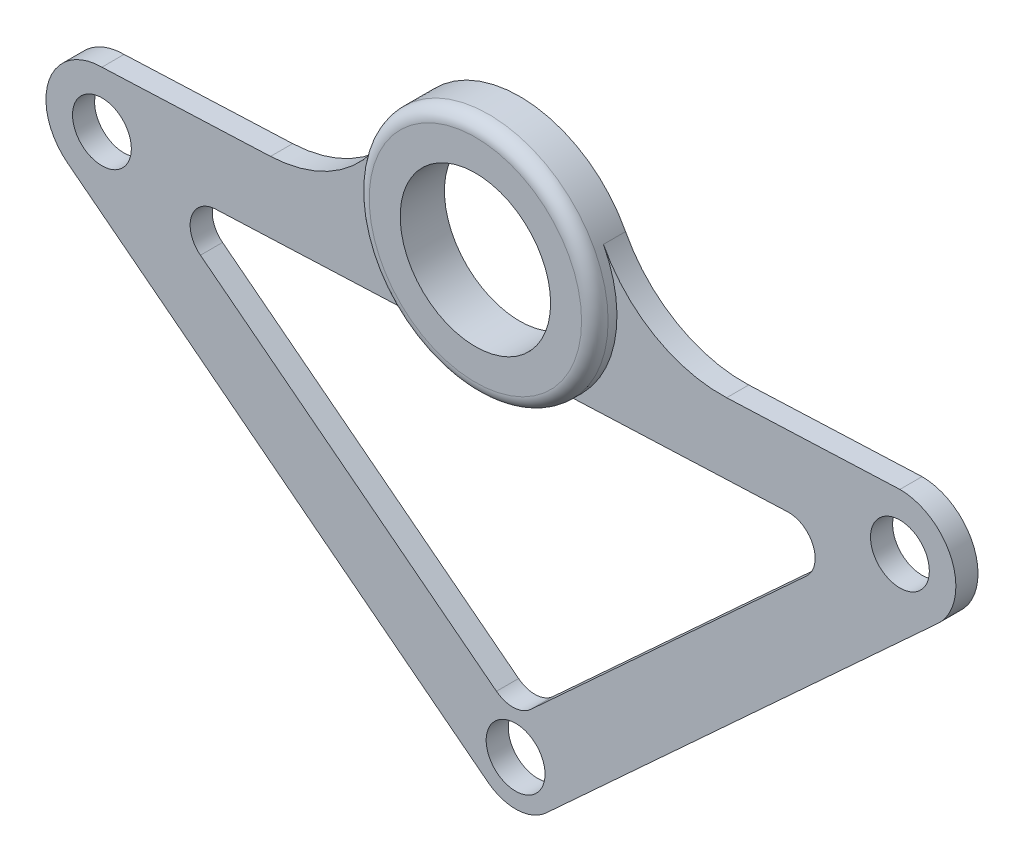
ISO-10303-21;
HEADER;
FILE_DESCRIPTION(('STEP AP214'),'2;1');
FILE_NAME('part.step','',(''),(''),'','','');
FILE_SCHEMA(('AUTOMOTIVE_DESIGN { 1 0 10303 214 1 1 1 1 }'));
ENDSEC;
DATA;
#1=APPLICATION_CONTEXT('core data for automotive mechanical design processes');
#2=APPLICATION_PROTOCOL_DEFINITION('international standard','automotive_design',2000,#1);
#3=PRODUCT_CONTEXT('',#1,'mechanical');
#4=PRODUCT('Part','Part','',(#3));
#5=PRODUCT_RELATED_PRODUCT_CATEGORY('part','',(#4));
#6=PRODUCT_DEFINITION_FORMATION('','',#4);
#7=PRODUCT_DEFINITION_CONTEXT('part definition',#1,'design');
#8=PRODUCT_DEFINITION('design','',#6,#7);
#9=PRODUCT_DEFINITION_SHAPE('','',#8);
#10=(LENGTH_UNIT() NAMED_UNIT(*) SI_UNIT(.MILLI.,.METRE.));
#11=(NAMED_UNIT(*) PLANE_ANGLE_UNIT() SI_UNIT($,.RADIAN.));
#12=(NAMED_UNIT(*) SI_UNIT($,.STERADIAN.) SOLID_ANGLE_UNIT());
#13=UNCERTAINTY_MEASURE_WITH_UNIT(LENGTH_MEASURE(1.E-05),#10,'distance_accuracy_value','');
#14=(GEOMETRIC_REPRESENTATION_CONTEXT(3) GLOBAL_UNCERTAINTY_ASSIGNED_CONTEXT((#13)) GLOBAL_UNIT_ASSIGNED_CONTEXT((#10,
#11,#12)) REPRESENTATION_CONTEXT('',''));
#15=CARTESIAN_POINT('',(0.,0.,0.));
#16=DIRECTION('',(0.,0.,1.));
#17=DIRECTION('',(1.,0.,0.));
#18=AXIS2_PLACEMENT_3D('',#15,#16,#17);
#19=CARTESIAN_POINT('',(-0.19211965126212,4.59853956074665,2.5));
#20=DIRECTION('',(0.0417419925818735,-0.999128423204592,0.));
#21=DIRECTION('',(0.999128423204592,0.0417419925818735,0.));
#22=AXIS2_PLACEMENT_3D('',#19,#20,#21);
#23=PLANE('',#22);
#24=DIRECTION('',(0.,0.,1.));
#25=VECTOR('',#24,1.);
#26=CARTESIAN_POINT('',(20.488732244139,5.46255258085056,-40.6837661840403));
#27=LINE('',#26,#25);
#28=CARTESIAN_POINT('',(20.488732244139,5.46255258085056,-2.5));
#29=VERTEX_POINT('',#28);
#30=CARTESIAN_POINT('',(20.4887322441516,5.46255258086065,0.));
#31=VERTEX_POINT('',#30);
#32=EDGE_CURVE('E170',#29,#31,#27,.T.);
#33=ORIENTED_EDGE('',*,*,#32,.F.);
#34=DIRECTION('',(-0.999128423204592,-0.0417419925818735,0.));
#35=VECTOR('',#34,1.);
#36=CARTESIAN_POINT('',(-0.19211965126212,4.59853956074665,-2.5));
#37=LINE('',#36,#35);
#38=CARTESIAN_POINT('',(44.820399723161,6.47909085543628,-2.5));
#39=VERTEX_POINT('',#38);
#40=EDGE_CURVE('E180',#39,#29,#37,.T.);
#41=ORIENTED_EDGE('',*,*,#40,.F.);
#42=DIRECTION('',(0.,0.,-1.));
#43=VECTOR('',#42,1.);
#44=CARTESIAN_POINT('',(44.820399723161,6.47909085543628,2.5));
#45=LINE('',#44,#43);
#46=CARTESIAN_POINT('',(44.820399723161,6.47909085543628,0.));
#47=VERTEX_POINT('',#46);
#48=EDGE_CURVE('E209',#47,#39,#45,.T.);
#49=ORIENTED_EDGE('',*,*,#48,.F.);
#50=DIRECTION('',(-0.999128423204592,-0.0417419925818735,0.));
#51=VECTOR('',#50,1.);
#52=CARTESIAN_POINT('',(-0.19211965126212,4.59853956074665,0.));
#53=LINE('',#52,#51);
#54=EDGE_CURVE('E182',#47,#31,#53,.T.);
#55=ORIENTED_EDGE('',*,*,#54,.T.);
#56=EDGE_LOOP('',(#33,#41,#49,#55));
#57=FACE_BOUND('',#56,.T.);
#58=ADVANCED_FACE('F42',(#57),#23,.T.);
#59=CARTESIAN_POINT('',(-8.8542481683794,-11.4164608048564,2.5));
#60=DIRECTION('',(0.612852318232689,0.790197466483422,0.));
#61=DIRECTION('',(-0.790197466483422,0.612852318232689,0.));
#62=AXIS2_PLACEMENT_3D('',#59,#60,#61);
#63=PLANE('',#62);
#64=DIRECTION('',(0.,0.,-1.));
#65=VECTOR('',#64,1.);
#66=CARTESIAN_POINT('',(-21.5253821373528,-1.58912756613958,2.5));
#67=LINE('',#66,#65);
#68=CARTESIAN_POINT('',(-21.5253821373528,-1.58912756613959,0.));
#69=VERTEX_POINT('',#68);
#70=CARTESIAN_POINT('',(-21.5253821373528,-1.58912756613958,-2.5));
#71=VERTEX_POINT('',#70);
#72=EDGE_CURVE('E214',#69,#71,#67,.T.);
#73=ORIENTED_EDGE('',*,*,#72,.F.);
#74=DIRECTION('',(0.790197466483422,-0.612852318232689,0.));
#75=VECTOR('',#74,1.);
#76=CARTESIAN_POINT('',(-8.8542481683794,-11.4164608048564,0.));
#77=LINE('',#76,#75);
#78=CARTESIAN_POINT('',(11.9313136502869,-27.5370892384402,0.));
#79=VERTEX_POINT('',#78);
#80=EDGE_CURVE('E295',#69,#79,#77,.T.);
#81=ORIENTED_EDGE('',*,*,#80,.T.);
#82=DIRECTION('',(0.,0.,-1.));
#83=VECTOR('',#82,1.);
#84=CARTESIAN_POINT('',(11.9313136502869,-27.5370892384402,2.5));
#85=LINE('',#84,#83);
#86=CARTESIAN_POINT('',(11.9313136502869,-27.5370892384402,-2.5));
#87=VERTEX_POINT('',#86);
#88=EDGE_CURVE('E65',#79,#87,#85,.T.);
#89=ORIENTED_EDGE('',*,*,#88,.T.);
#90=DIRECTION('',(0.790197466483422,-0.61285231823269,0.));
#91=VECTOR('',#90,1.);
#92=CARTESIAN_POINT('',(-8.8542481683794,-11.4164608048564,-2.5));
#93=LINE('',#92,#91);
#94=EDGE_CURVE('E367',#71,#87,#93,.T.);
#95=ORIENTED_EDGE('',*,*,#94,.F.);
#96=EDGE_LOOP('',(#73,#81,#89,#95));
#97=FACE_BOUND('',#96,.T.);
#98=ADVANCED_FACE('F253',(#97),#63,.T.);
#99=CARTESIAN_POINT('',(-19.6868251826548,0.781464833310679,2.5));
#100=DIRECTION('',(0.,0.,-1.));
#101=DIRECTION('',(-1.,0.,0.));
#102=AXIS2_PLACEMENT_3D('',#99,#100,#101);
#103=CYLINDRICAL_SURFACE('',#102,3.);
#104=CARTESIAN_POINT('',(-19.6868251826548,0.781464833310679,0.));
#105=DIRECTION('',(0.,0.,1.));
#106=DIRECTION('',(1.,0.,0.));
#107=AXIS2_PLACEMENT_3D('',#104,#105,#106);
#108=CIRCLE('',#107,3.);
#109=CARTESIAN_POINT('',(-19.8120511604004,3.77885010292446,0.));
#110=VERTEX_POINT('',#109);
#111=EDGE_CURVE('E282',#69,#110,#108,.F.);
#112=ORIENTED_EDGE('',*,*,#111,.F.);
#113=ORIENTED_EDGE('',*,*,#72,.T.);
#114=CARTESIAN_POINT('',(-19.6868251826548,0.781464833310679,-2.5));
#115=DIRECTION('',(0.,0.,1.));
#116=DIRECTION('',(1.,0.,0.));
#117=AXIS2_PLACEMENT_3D('',#114,#115,#116);
#118=CIRCLE('',#117,3.);
#119=CARTESIAN_POINT('',(-19.8120511604004,3.77885010292446,-2.5));
#120=VERTEX_POINT('',#119);
#121=EDGE_CURVE('E194',#71,#120,#118,.F.);
#122=ORIENTED_EDGE('',*,*,#121,.T.);
#123=DIRECTION('',(0.,0.,-1.));
#124=VECTOR('',#123,1.);
#125=CARTESIAN_POINT('',(-19.8120511604004,3.77885010292446,2.5));
#126=LINE('',#125,#124);
#127=EDGE_CURVE('E211',#110,#120,#126,.T.);
#128=ORIENTED_EDGE('',*,*,#127,.F.);
#129=EDGE_LOOP('',(#112,#113,#122,#128));
#130=FACE_BOUND('',#129,.T.);
#131=ADVANCED_FACE('F259',(#130),#103,.F.);
#132=DIRECTION('',(0.,0.,1.));
#133=VECTOR('',#132,1.);
#134=CARTESIAN_POINT('',(4.51961631861225,4.79538837750978,-40.6837661840403));
#135=LINE('',#134,#133);
#136=CARTESIAN_POINT('',(4.51961631861225,4.79538837750978,0.));
#137=VERTEX_POINT('',#136);
#138=CARTESIAN_POINT('',(4.51961631861225,4.79538837750978,-2.5));
#139=VERTEX_POINT('',#138);
#140=EDGE_CURVE('E173',#137,#139,#135,.F.);
#141=ORIENTED_EDGE('',*,*,#140,.F.);
#142=EDGE_CURVE('E275',#137,#110,#53,.T.);
#143=ORIENTED_EDGE('',*,*,#142,.T.);
#144=ORIENTED_EDGE('',*,*,#127,.T.);
#145=EDGE_CURVE('E190',#139,#120,#37,.T.);
#146=ORIENTED_EDGE('',*,*,#145,.F.);
#147=EDGE_LOOP('',(#141,#143,#144,#146));
#148=FACE_BOUND('',#147,.T.);
#149=ADVANCED_FACE('F255',(#148),#23,.T.);
#150=CARTESIAN_POINT('',(44.9456257009067,3.4817055858225,2.5));
#151=DIRECTION('',(0.,0.,-1.));
#152=DIRECTION('',(-1.,0.,0.));
#153=AXIS2_PLACEMENT_3D('',#150,#151,#152);
#154=CYLINDRICAL_SURFACE('',#153,3.);
#155=DIRECTION('',(0.,0.,-1.));
#156=VECTOR('',#155,1.);
#157=CARTESIAN_POINT('',(46.9755096845863,1.27273048120931,2.5));
#158=LINE('',#157,#156);
#159=CARTESIAN_POINT('',(46.9755096845863,1.27273048120931,0.));
#160=VERTEX_POINT('',#159);
#161=CARTESIAN_POINT('',(46.9755096845863,1.27273048120931,-2.5));
#162=VERTEX_POINT('',#161);
#163=EDGE_CURVE('E207',#160,#162,#158,.T.);
#164=ORIENTED_EDGE('',*,*,#163,.F.);
#165=CARTESIAN_POINT('',(44.9456257009067,3.4817055858225,0.));
#166=DIRECTION('',(0.,0.,1.));
#167=DIRECTION('',(1.,0.,0.));
#168=AXIS2_PLACEMENT_3D('',#165,#166,#167);
#169=CIRCLE('',#168,3.);
#170=EDGE_CURVE('E290',#160,#47,#169,.T.);
#171=ORIENTED_EDGE('',*,*,#170,.T.);
#172=ORIENTED_EDGE('',*,*,#48,.T.);
#173=CARTESIAN_POINT('',(44.9456257009067,3.4817055858225,-2.5));
#174=DIRECTION('',(0.,0.,1.));
#175=DIRECTION('',(1.,0.,0.));
#176=AXIS2_PLACEMENT_3D('',#173,#174,#175);
#177=CIRCLE('',#176,3.);
#178=EDGE_CURVE('E189',#162,#39,#177,.T.);
#179=ORIENTED_EDGE('',*,*,#178,.F.);
#180=EDGE_LOOP('',(#164,#171,#172,#179));
#181=FACE_BOUND('',#180,.T.);
#182=ADVANCED_FACE('F264',(#181),#154,.F.);
#183=CARTESIAN_POINT('',(20.872486130044,-22.7140085853932,2.5));
#184=DIRECTION('',(-0.676627994559879,0.736325034871066,0.));
#185=DIRECTION('',(-0.736325034871066,-0.676627994559879,0.));
#186=AXIS2_PLACEMENT_3D('',#183,#184,#185);
#187=PLANE('',#186);
#188=DIRECTION('',(0.,0.,-1.));
#189=VECTOR('',#188,1.);
#190=CARTESIAN_POINT('',(15.7997545886646,-27.3754719436031,2.5));
#191=LINE('',#190,#189);
#192=CARTESIAN_POINT('',(15.7997545886646,-27.3754719436031,0.));
#193=VERTEX_POINT('',#192);
#194=CARTESIAN_POINT('',(15.7997545886646,-27.3754719436031,-2.5));
#195=VERTEX_POINT('',#194);
#196=EDGE_CURVE('E204',#193,#195,#191,.T.);
#197=ORIENTED_EDGE('',*,*,#196,.F.);
#198=DIRECTION('',(0.736325034871066,0.676627994559879,0.));
#199=VECTOR('',#198,1.);
#200=CARTESIAN_POINT('',(20.872486130044,-22.7140085853932,0.));
#201=LINE('',#200,#199);
#202=EDGE_CURVE('E287',#193,#160,#201,.T.);
#203=ORIENTED_EDGE('',*,*,#202,.T.);
#204=ORIENTED_EDGE('',*,*,#163,.T.);
#205=DIRECTION('',(0.736325034871066,0.676627994559879,0.));
#206=VECTOR('',#205,1.);
#207=CARTESIAN_POINT('',(20.872486130044,-22.7140085853932,-2.5));
#208=LINE('',#207,#206);
#209=EDGE_CURVE('E192',#195,#162,#208,.T.);
#210=ORIENTED_EDGE('',*,*,#209,.F.);
#211=EDGE_LOOP('',(#197,#203,#204,#210));
#212=FACE_BOUND('',#211,.T.);
#213=ADVANCED_FACE('F270',(#212),#187,.T.);
#214=CARTESIAN_POINT('',(37.3163550542018,29.1856475864808,2.5));
#215=DIRECTION('',(0.,0.,-1.));
#216=DIRECTION('',(-1.,0.,0.));
#217=AXIS2_PLACEMENT_3D('',#214,#215,#216);
#218=CYLINDRICAL_SURFACE('',#217,15.);
#219=DIRECTION('',(0.,0.,-1.));
#220=VECTOR('',#219,1.);
#221=CARTESIAN_POINT('',(24.0182734467296,22.2458330672727,2.5));
#222=LINE('',#221,#220);
#223=CARTESIAN_POINT('',(24.0182734467284,22.2458330672721,0.));
#224=VERTEX_POINT('',#223);
#225=CARTESIAN_POINT('',(24.0182734467296,22.2458330672727,-2.5));
#226=VERTEX_POINT('',#225);
#227=EDGE_CURVE('E205',#224,#226,#222,.T.);
#228=ORIENTED_EDGE('',*,*,#227,.F.);
#229=CARTESIAN_POINT('',(37.3163550542018,29.1856475864808,0.));
#230=DIRECTION('',(0.,0.,1.));
#231=DIRECTION('',(1.,0.,0.));
#232=AXIS2_PLACEMENT_3D('',#229,#230,#231);
#233=CIRCLE('',#232,15.);
#234=CARTESIAN_POINT('',(37.9424849429299,14.1987212384119,0.));
#235=VERTEX_POINT('',#234);
#236=EDGE_CURVE('E313',#224,#235,#233,.T.);
#237=ORIENTED_EDGE('',*,*,#236,.T.);
#238=DIRECTION('',(0.,0.,-1.));
#239=VECTOR('',#238,1.);
#240=CARTESIAN_POINT('',(37.9424849429299,14.1987212384119,2.5));
#241=LINE('',#240,#239);
#242=CARTESIAN_POINT('',(37.9424849429299,14.1987212384119,-2.5));
#243=VERTEX_POINT('',#242);
#244=EDGE_CURVE('E217',#235,#243,#241,.T.);
#245=ORIENTED_EDGE('',*,*,#244,.T.);
#246=CARTESIAN_POINT('',(37.3163550542018,29.1856475864808,-2.5));
#247=DIRECTION('',(0.,0.,1.));
#248=DIRECTION('',(1.,0.,0.));
#249=AXIS2_PLACEMENT_3D('',#246,#247,#248);
#250=CIRCLE('',#249,15.);
#251=EDGE_CURVE('E325',#226,#243,#250,.T.);
#252=ORIENTED_EDGE('',*,*,#251,.F.);
#253=EDGE_LOOP('',(#228,#237,#245,#252));
#254=FACE_BOUND('',#253,.T.);
#255=ADVANCED_FACE('F382',(#254),#218,.F.);
#256=CARTESIAN_POINT('',(-14.2281381501997,27.0322008392913,2.5));
#257=DIRECTION('',(0.,0.,-1.));
#258=DIRECTION('',(-1.,0.,0.));
#259=AXIS2_PLACEMENT_3D('',#256,#257,#258);
#260=CYLINDRICAL_SURFACE('',#259,15.);
#261=DIRECTION('',(0.,0.,-1.));
#262=VECTOR('',#261,1.);
#263=CARTESIAN_POINT('',(-13.6020082614716,12.0452744912224,2.5));
#264=LINE('',#263,#262);
#265=CARTESIAN_POINT('',(-13.6020082614716,12.0452744912224,0.));
#266=VERTEX_POINT('',#265);
#267=CARTESIAN_POINT('',(-13.6020082614716,12.0452744912224,-2.5));
#268=VERTEX_POINT('',#267);
#269=EDGE_CURVE('E231',#266,#268,#264,.T.);
#270=ORIENTED_EDGE('',*,*,#269,.F.);
#271=CARTESIAN_POINT('',(-14.2281381501997,27.0322008392913,0.));
#272=DIRECTION('',(0.,0.,1.));
#273=DIRECTION('',(1.,0.,0.));
#274=AXIS2_PLACEMENT_3D('',#271,#272,#273);
#275=CIRCLE('',#274,15.);
#276=CARTESIAN_POINT('',(-0.397539123787288,21.22577934493,0.));
#277=VERTEX_POINT('',#276);
#278=EDGE_CURVE('E311',#266,#277,#275,.T.);
#279=ORIENTED_EDGE('',*,*,#278,.T.);
#280=DIRECTION('',(0.,0.,-1.));
#281=VECTOR('',#280,1.);
#282=CARTESIAN_POINT('',(-0.397539123776427,21.2257793449198,2.5));
#283=LINE('',#282,#281);
#284=CARTESIAN_POINT('',(-0.397539123776427,21.2257793449198,-2.5));
#285=VERTEX_POINT('',#284);
#286=EDGE_CURVE('E233',#277,#285,#283,.T.);
#287=ORIENTED_EDGE('',*,*,#286,.T.);
#288=CARTESIAN_POINT('',(-14.2281381501997,27.0322008392913,-2.5));
#289=DIRECTION('',(0.,0.,1.));
#290=DIRECTION('',(1.,0.,0.));
#291=AXIS2_PLACEMENT_3D('',#288,#289,#290);
#292=CIRCLE('',#291,15.);
#293=EDGE_CURVE('E332',#268,#285,#292,.T.);
#294=ORIENTED_EDGE('',*,*,#293,.F.);
#295=EDGE_LOOP('',(#270,#279,#287,#294));
#296=FACE_BOUND('',#295,.T.);
#297=ADVANCED_FACE('F393',(#296),#260,.F.);
#298=CARTESIAN_POINT('',(-0.526055591917078,12.5915669463833,2.5));
#299=DIRECTION('',(0.0417419925818713,-0.999128423204592,0.));
#300=DIRECTION('',(0.999128423204592,0.0417419925818713,0.));
#301=AXIS2_PLACEMENT_3D('',#298,#299,#300);
#302=PLANE('',#301);
#303=DIRECTION('',(-0.999128423204592,-0.0417419925818713,0.));
#304=VECTOR('',#303,1.);
#305=CARTESIAN_POINT('',(-0.526055591917078,12.5915669463833,0.));
#306=LINE('',#305,#304);
#307=CARTESIAN_POINT('',(-32.6566394074545,11.2492023812864,0.));
#308=VERTEX_POINT('',#307);
#309=EDGE_CURVE('E309',#266,#308,#306,.T.);
#310=ORIENTED_EDGE('',*,*,#309,.F.);
#311=ORIENTED_EDGE('',*,*,#269,.T.);
#312=DIRECTION('',(-0.999128423204592,-0.0417419925818713,0.));
#313=VECTOR('',#312,1.);
#314=CARTESIAN_POINT('',(-0.526055591917078,12.5915669463833,-2.5));
#315=LINE('',#314,#313);
#316=CARTESIAN_POINT('',(-32.6566394074545,11.2492023812981,-2.5));
#317=VERTEX_POINT('',#316);
#318=EDGE_CURVE('E335',#268,#317,#315,.T.);
#319=ORIENTED_EDGE('',*,*,#318,.T.);
#320=DIRECTION('',(0.,0.,-1.));
#321=VECTOR('',#320,1.);
#322=CARTESIAN_POINT('',(-32.6566394074545,11.2492023812981,2.5));
#323=LINE('',#322,#321);
#324=EDGE_CURVE('E229',#308,#317,#323,.T.);
#325=ORIENTED_EDGE('',*,*,#324,.F.);
#326=EDGE_LOOP('',(#310,#311,#319,#325));
#327=FACE_BOUND('',#326,.T.);
#328=ADVANCED_FACE('F398',(#327),#302,.F.);
#329=CARTESIAN_POINT('',(-32.6566394074544,4.92420238127972,2.5));
#330=DIRECTION('',(0.,0.,-1.));
#331=DIRECTION('',(-1.,0.,0.));
#332=AXIS2_PLACEMENT_3D('',#329,#330,#331);
#333=CYLINDRICAL_SURFACE('',#332,6.32500000000671);
#334=CARTESIAN_POINT('',(-32.6566394074544,4.92420238127972,0.));
#335=DIRECTION('',(0.,0.,1.));
#336=DIRECTION('',(1.,0.,0.));
#337=AXIS2_PLACEMENT_3D('',#334,#335,#336);
#338=CIRCLE('',#337,6.32500000000671);
#339=CARTESIAN_POINT('',(-36.5329303202918,-0.0737965942095922,0.));
#340=VERTEX_POINT('',#339);
#341=EDGE_CURVE('E307',#308,#340,#338,.T.);
#342=ORIENTED_EDGE('',*,*,#341,.F.);
#343=ORIENTED_EDGE('',*,*,#324,.T.);
#344=CARTESIAN_POINT('',(-32.6566394074544,4.92420238127972,-2.5));
#345=DIRECTION('',(0.,0.,1.));
#346=DIRECTION('',(1.,0.,0.));
#347=AXIS2_PLACEMENT_3D('',#344,#345,#346);
#348=CIRCLE('',#347,6.32500000000671);
#349=CARTESIAN_POINT('',(-36.5329303202918,-0.0737965942095922,-2.5));
#350=VERTEX_POINT('',#349);
#351=EDGE_CURVE('E338',#317,#350,#348,.T.);
#352=ORIENTED_EDGE('',*,*,#351,.T.);
#353=DIRECTION('',(0.,0.,-1.));
#354=VECTOR('',#353,1.);
#355=CARTESIAN_POINT('',(-36.5329303202918,-0.0737965942095922,2.5));
#356=LINE('',#355,#354);
#357=EDGE_CURVE('E227',#340,#350,#356,.T.);
#358=ORIENTED_EDGE('',*,*,#357,.F.);
#359=EDGE_LOOP('',(#342,#343,#352,#358));
#360=FACE_BOUND('',#359,.T.);
#361=ADVANCED_FACE('F400',(#360),#333,.T.);
#362=CARTESIAN_POINT('',(-13.7570667142409,-17.7380405367238,2.5));
#363=DIRECTION('',(0.612852318232689,0.790197466483422,0.));
#364=DIRECTION('',(-0.790197466483422,0.612852318232689,0.));
#365=AXIS2_PLACEMENT_3D('',#362,#363,#364);
#366=PLANE('',#365);
#367=DIRECTION('',(0.790197466483422,-0.612852318232689,0.));
#368=VECTOR('',#367,1.);
#369=CARTESIAN_POINT('',(-13.7570667142409,-17.7380405367238,0.));
#370=LINE('',#369,#368);
#371=CARTESIAN_POINT('',(10.9800575124747,-36.9233765720561,0.));
#372=VERTEX_POINT('',#371);
#373=EDGE_CURVE('E305',#340,#372,#370,.T.);
#374=ORIENTED_EDGE('',*,*,#373,.F.);
#375=ORIENTED_EDGE('',*,*,#357,.T.);
#376=DIRECTION('',(0.790197466483422,-0.612852318232689,0.));
#377=VECTOR('',#376,1.);
#378=CARTESIAN_POINT('',(-13.7570667142409,-17.7380405367238,-2.5));
#379=LINE('',#378,#377);
#380=CARTESIAN_POINT('',(10.9800575124747,-36.923376572056,-2.5));
#381=VERTEX_POINT('',#380);
#382=EDGE_CURVE('E341',#350,#381,#379,.T.);
#383=ORIENTED_EDGE('',*,*,#382,.T.);
#384=DIRECTION('',(0.,0.,-1.));
#385=VECTOR('',#384,1.);
#386=CARTESIAN_POINT('',(10.9800575124747,-36.923376572056,2.5));
#387=LINE('',#386,#385);
#388=EDGE_CURVE('E225',#372,#381,#387,.T.);
#389=ORIENTED_EDGE('',*,*,#388,.F.);
#390=EDGE_LOOP('',(#374,#375,#383,#389));
#391=FACE_BOUND('',#390,.T.);
#392=ADVANCED_FACE('F407',(#391),#366,.F.);
#393=CARTESIAN_POINT('',(14.0933472890967,-32.9091734423203,2.5));
#394=DIRECTION('',(0.,0.,-1.));
#395=DIRECTION('',(-1.,0.,0.));
#396=AXIS2_PLACEMENT_3D('',#393,#394,#395);
#397=CYLINDRICAL_SURFACE('',#396,5.08000000000001);
#398=CARTESIAN_POINT('',(14.0933472890967,-32.9091734423203,0.));
#399=DIRECTION('',(0.,0.,1.));
#400=DIRECTION('',(1.,0.,0.));
#401=AXIS2_PLACEMENT_3D('',#398,#399,#400);
#402=CIRCLE('',#401,5.08000000000001);
#403=CARTESIAN_POINT('',(17.5306175014609,-36.6497046194653,0.));
#404=VERTEX_POINT('',#403);
#405=EDGE_CURVE('E303',#372,#404,#402,.T.);
#406=ORIENTED_EDGE('',*,*,#405,.F.);
#407=ORIENTED_EDGE('',*,*,#388,.T.);
#408=CARTESIAN_POINT('',(14.0933472890967,-32.9091734423203,-2.5));
#409=DIRECTION('',(0.,0.,1.));
#410=DIRECTION('',(1.,0.,0.));
#411=AXIS2_PLACEMENT_3D('',#408,#409,#410);
#412=CIRCLE('',#411,5.08000000000001);
#413=CARTESIAN_POINT('',(17.5306175014609,-36.6497046194653,-2.5));
#414=VERTEX_POINT('',#413);
#415=EDGE_CURVE('E344',#381,#414,#412,.T.);
#416=ORIENTED_EDGE('',*,*,#415,.T.);
#417=DIRECTION('',(0.,0.,-1.));
#418=VECTOR('',#417,1.);
#419=CARTESIAN_POINT('',(17.5306175014609,-36.6497046194653,2.5));
#420=LINE('',#419,#418);
#421=EDGE_CURVE('E223',#404,#414,#420,.T.);
#422=ORIENTED_EDGE('',*,*,#421,.F.);
#423=EDGE_LOOP('',(#406,#407,#416,#422));
#424=FACE_BOUND('',#423,.T.);
#425=ADVANCED_FACE('F410',(#424),#397,.T.);
#426=CARTESIAN_POINT('',(26.285510086523,-28.6046088643617,2.5));
#427=DIRECTION('',(-0.676627994559879,0.736325034871066,0.));
#428=DIRECTION('',(-0.736325034871066,-0.676627994559879,0.));
#429=AXIS2_PLACEMENT_3D('',#426,#427,#428);
#430=PLANE('',#429);
#431=DIRECTION('',(0.736325034871066,0.676627994559879,0.));
#432=VECTOR('',#431,1.);
#433=CARTESIAN_POINT('',(26.285510086523,-28.6046088643617,0.));
#434=LINE('',#433,#432);
#435=CARTESIAN_POINT('',(61.8043641365677,4.0345787861778,0.));
#436=VERTEX_POINT('',#435);
#437=EDGE_CURVE('E301',#404,#436,#434,.T.);
#438=ORIENTED_EDGE('',*,*,#437,.F.);
#439=ORIENTED_EDGE('',*,*,#421,.T.);
#440=DIRECTION('',(0.736325034871066,0.676627994559879,0.));
#441=VECTOR('',#440,1.);
#442=CARTESIAN_POINT('',(26.285510086523,-28.6046088643617,-2.5));
#443=LINE('',#442,#441);
#444=CARTESIAN_POINT('',(61.8043641365677,4.0345787861778,-2.5));
#445=VERTEX_POINT('',#444);
#446=EDGE_CURVE('E347',#414,#445,#443,.T.);
#447=ORIENTED_EDGE('',*,*,#446,.T.);
#448=DIRECTION('',(0.,0.,-1.));
#449=VECTOR('',#448,1.);
#450=CARTESIAN_POINT('',(61.8043641365677,4.0345787861778,2.5));
#451=LINE('',#450,#449);
#452=EDGE_CURVE('E221',#436,#445,#451,.T.);
#453=ORIENTED_EDGE('',*,*,#452,.F.);
#454=EDGE_LOOP('',(#438,#439,#447,#453));
#455=FACE_BOUND('',#454,.T.);
#456=ADVANCED_FACE('F417',(#455),#430,.F.);
#457=CARTESIAN_POINT('',(57.5246920709766,8.69183463173721,2.5));
#458=DIRECTION('',(0.,0.,-1.));
#459=DIRECTION('',(-1.,0.,0.));
#460=AXIS2_PLACEMENT_3D('',#457,#458,#459);
#461=CYLINDRICAL_SURFACE('',#460,6.3249999999999);
#462=CARTESIAN_POINT('',(57.5246920709766,8.69183463173721,0.));
#463=DIRECTION('',(0.,0.,1.));
#464=DIRECTION('',(1.,0.,0.));
#465=AXIS2_PLACEMENT_3D('',#462,#463,#464);
#466=CIRCLE('',#465,6.3249999999999);
#467=CARTESIAN_POINT('',(57.5246920709766,15.0168346317371,0.));
#468=VERTEX_POINT('',#467);
#469=EDGE_CURVE('E299',#436,#468,#466,.T.);
#470=ORIENTED_EDGE('',*,*,#469,.F.);
#471=ORIENTED_EDGE('',*,*,#452,.T.);
#472=CARTESIAN_POINT('',(57.5246920709766,8.69183463173721,-2.5));
#473=DIRECTION('',(0.,0.,1.));
#474=DIRECTION('',(1.,0.,0.));
#475=AXIS2_PLACEMENT_3D('',#472,#473,#474);
#476=CIRCLE('',#475,6.3249999999999);
#477=CARTESIAN_POINT('',(57.5246920709766,15.0168346317371,-2.5));
#478=VERTEX_POINT('',#477);
#479=EDGE_CURVE('E350',#445,#478,#476,.T.);
#480=ORIENTED_EDGE('',*,*,#479,.T.);
#481=DIRECTION('',(0.,0.,-1.));
#482=VECTOR('',#481,1.);
#483=CARTESIAN_POINT('',(57.5246920709766,15.0168346317371,2.5));
#484=LINE('',#483,#482);
#485=EDGE_CURVE('E219',#468,#478,#484,.T.);
#486=ORIENTED_EDGE('',*,*,#485,.F.);
#487=EDGE_LOOP('',(#470,#471,#480,#486));
#488=FACE_BOUND('',#487,.T.);
#489=ADVANCED_FACE('F419',(#488),#461,.T.);
#490=CARTESIAN_POINT('',(-32.6566394074544,4.92420238127972,2.5));
#491=DIRECTION('',(0.,0.,-1.));
#492=DIRECTION('',(-1.,0.,0.));
#493=AXIS2_PLACEMENT_3D('',#490,#491,#492);
#494=CYLINDRICAL_SURFACE('',#493,3.32499999999999);
#495=CARTESIAN_POINT('',(-32.6566394074544,4.92420238127972,-2.5));
#496=DIRECTION('',(0.,0.,1.));
#497=DIRECTION('',(1.,0.,0.));
#498=AXIS2_PLACEMENT_3D('',#495,#496,#497);
#499=CIRCLE('',#498,3.32499999999999);
#500=CARTESIAN_POINT('',(-29.3316394074545,4.92420238127972,-2.5));
#501=VERTEX_POINT('',#500);
#502=EDGE_CURVE('E365',#501,#501,#499,.T.);
#503=ORIENTED_EDGE('',*,*,#502,.F.);
#504=EDGE_LOOP('',(#503));
#505=FACE_BOUND('',#504,.T.);
#506=CARTESIAN_POINT('',(-32.6566394074544,4.92420238127972,0.));
#507=DIRECTION('',(0.,0.,1.));
#508=DIRECTION('',(1.,0.,0.));
#509=AXIS2_PLACEMENT_3D('',#506,#507,#508);
#510=CIRCLE('',#509,3.32499999999999);
#511=CARTESIAN_POINT('',(-29.3316394074545,4.92420238127972,0.));
#512=VERTEX_POINT('',#511);
#513=EDGE_CURVE('E322',#512,#512,#510,.T.);
#514=ORIENTED_EDGE('',*,*,#513,.T.);
#515=EDGE_LOOP('',(#514));
#516=FACE_BOUND('',#515,.T.);
#517=ADVANCED_FACE('F440',(#505,#516),#494,.F.);
#518=CARTESIAN_POINT('',(14.0933472890967,-32.9091734423203,2.5));
#519=DIRECTION('',(0.,0.,-1.));
#520=DIRECTION('',(-1.,0.,0.));
#521=AXIS2_PLACEMENT_3D('',#518,#519,#520);
#522=CYLINDRICAL_SURFACE('',#521,3.325);
#523=CARTESIAN_POINT('',(14.0933472890967,-32.9091734423203,-2.5));
#524=DIRECTION('',(0.,0.,1.));
#525=DIRECTION('',(1.,0.,0.));
#526=AXIS2_PLACEMENT_3D('',#523,#524,#525);
#527=CIRCLE('',#526,3.325);
#528=CARTESIAN_POINT('',(17.4183472890967,-32.9091734423203,-2.5));
#529=VERTEX_POINT('',#528);
#530=EDGE_CURVE('E362',#529,#529,#527,.T.);
#531=ORIENTED_EDGE('',*,*,#530,.F.);
#532=EDGE_LOOP('',(#531));
#533=FACE_BOUND('',#532,.T.);
#534=CARTESIAN_POINT('',(14.0933472890967,-32.9091734423203,0.));
#535=DIRECTION('',(0.,0.,1.));
#536=DIRECTION('',(1.,0.,0.));
#537=AXIS2_PLACEMENT_3D('',#534,#535,#536);
#538=CIRCLE('',#537,3.325);
#539=CARTESIAN_POINT('',(17.4183472890967,-32.9091734423203,0.));
#540=VERTEX_POINT('',#539);
#541=EDGE_CURVE('E319',#540,#540,#538,.T.);
#542=ORIENTED_EDGE('',*,*,#541,.T.);
#543=EDGE_LOOP('',(#542));
#544=FACE_BOUND('',#543,.T.);
#545=ADVANCED_FACE('F432',(#533,#544),#522,.F.);
#546=CARTESIAN_POINT('',(57.5246920709766,8.69183463173721,2.5));
#547=DIRECTION('',(0.,0.,-1.));
#548=DIRECTION('',(-1.,0.,0.));
#549=AXIS2_PLACEMENT_3D('',#546,#547,#548);
#550=CYLINDRICAL_SURFACE('',#549,3.325);
#551=CARTESIAN_POINT('',(57.5246920709766,8.69183463173721,-2.5));
#552=DIRECTION('',(0.,0.,1.));
#553=DIRECTION('',(1.,0.,0.));
#554=AXIS2_PLACEMENT_3D('',#551,#552,#553);
#555=CIRCLE('',#554,3.325);
#556=CARTESIAN_POINT('',(60.8496920709766,8.69183463173721,-2.5));
#557=VERTEX_POINT('',#556);
#558=EDGE_CURVE('E359',#557,#557,#555,.T.);
#559=ORIENTED_EDGE('',*,*,#558,.F.);
#560=EDGE_LOOP('',(#559));
#561=FACE_BOUND('',#560,.T.);
#562=CARTESIAN_POINT('',(57.5246920709766,8.69183463173721,0.));
#563=DIRECTION('',(0.,0.,1.));
#564=DIRECTION('',(1.,0.,0.));
#565=AXIS2_PLACEMENT_3D('',#562,#563,#564);
#566=CIRCLE('',#565,3.325);
#567=CARTESIAN_POINT('',(60.8496920709766,8.69183463173721,0.));
#568=VERTEX_POINT('',#567);
#569=EDGE_CURVE('E316',#568,#568,#566,.T.);
#570=ORIENTED_EDGE('',*,*,#569,.T.);
#571=EDGE_LOOP('',(#570));
#572=FACE_BOUND('',#571,.T.);
#573=ADVANCED_FACE('F425',(#561,#572),#550,.F.);
#574=CARTESIAN_POINT('',(-0.526055591917079,12.5915669463833,2.5));
#575=DIRECTION('',(0.0417419925818714,-0.999128423204592,0.));
#576=DIRECTION('',(0.999128423204592,0.0417419925818714,0.));
#577=AXIS2_PLACEMENT_3D('',#574,#575,#576);
#578=PLANE('',#577);
#579=DIRECTION('',(-0.999128423204592,-0.0417419925818714,0.));
#580=VECTOR('',#579,1.);
#581=CARTESIAN_POINT('',(-0.526055591917079,12.5915669463833,0.));
#582=LINE('',#581,#580);
#583=EDGE_CURVE('E283',#468,#235,#582,.T.);
#584=ORIENTED_EDGE('',*,*,#583,.F.);
#585=ORIENTED_EDGE('',*,*,#485,.T.);
#586=DIRECTION('',(-0.999128423204592,-0.0417419925818714,0.));
#587=VECTOR('',#586,1.);
#588=CARTESIAN_POINT('',(-0.526055591917079,12.5915669463833,-2.5));
#589=LINE('',#588,#587);
#590=EDGE_CURVE('E353',#478,#243,#589,.T.);
#591=ORIENTED_EDGE('',*,*,#590,.T.);
#592=ORIENTED_EDGE('',*,*,#244,.F.);
#593=EDGE_LOOP('',(#584,#585,#591,#592));
#594=FACE_BOUND('',#593,.T.);
#595=ADVANCED_FACE('F423',(#594),#578,.F.);
#596=CARTESIAN_POINT('',(13.769870604985,-25.1664968389899,2.5));
#597=DIRECTION('',(0.,0.,-1.));
#598=DIRECTION('',(-1.,0.,0.));
#599=AXIS2_PLACEMENT_3D('',#596,#597,#598);
#600=CYLINDRICAL_SURFACE('',#599,3.);
#601=ORIENTED_EDGE('',*,*,#88,.F.);
#602=CARTESIAN_POINT('',(13.769870604985,-25.1664968389899,0.));
#603=DIRECTION('',(0.,0.,1.));
#604=DIRECTION('',(1.,0.,0.));
#605=AXIS2_PLACEMENT_3D('',#602,#603,#604);
#606=CIRCLE('',#605,3.);
#607=EDGE_CURVE('E216',#79,#193,#606,.T.);
#608=ORIENTED_EDGE('',*,*,#607,.T.);
#609=ORIENTED_EDGE('',*,*,#196,.T.);
#610=CARTESIAN_POINT('',(13.769870604985,-25.1664968389899,-2.5));
#611=DIRECTION('',(0.,0.,1.));
#612=DIRECTION('',(1.,0.,0.));
#613=AXIS2_PLACEMENT_3D('',#610,#611,#612);
#614=CIRCLE('',#613,3.);
#615=EDGE_CURVE('E199',#87,#195,#614,.T.);
#616=ORIENTED_EDGE('',*,*,#615,.F.);
#617=EDGE_LOOP('',(#601,#608,#609,#616));
#618=FACE_BOUND('',#617,.T.);
#619=ADVANCED_FACE('F373',(#618),#600,.F.);
#620=CARTESIAN_POINT('',(0.,0.,2.5));
#621=DIRECTION('',(0.,0.,1.));
#622=DIRECTION('',(1.,0.,0.));
#623=AXIS2_PLACEMENT_3D('',#620,#621,#622);
#624=PLANE('',#623);
#625=CARTESIAN_POINT('',(12.0500000000046,15.9999999999855,2.5));
#626=DIRECTION('',(0.,0.,1.));
#627=DIRECTION('',(1.,0.,0.));
#628=AXIS2_PLACEMENT_3D('',#625,#626,#627);
#629=CIRCLE('',#628,12.0000000000001);
#630=CARTESIAN_POINT('',(24.0500000000047,15.9999999999855,2.5));
#631=VERTEX_POINT('',#630);
#632=EDGE_CURVE('E50',#631,#631,#629,.T.);
#633=ORIENTED_EDGE('',*,*,#632,.T.);
#634=EDGE_LOOP('',(#633));
#635=FACE_BOUND('',#634,.T.);
#636=CARTESIAN_POINT('',(12.0500000000046,15.9999999999855,2.5));
#637=DIRECTION('',(0.,0.,1.));
#638=DIRECTION('',(1.,0.,0.));
#639=AXIS2_PLACEMENT_3D('',#636,#637,#638);
#640=CIRCLE('',#639,8.50000000000009);
#641=CARTESIAN_POINT('',(20.5500000000047,15.9999999999855,2.5));
#642=VERTEX_POINT('',#641);
#643=EDGE_CURVE('E202',#642,#642,#640,.T.);
#644=ORIENTED_EDGE('',*,*,#643,.F.);
#645=EDGE_LOOP('',(#644));
#646=FACE_BOUND('',#645,.T.);
#647=ADVANCED_FACE('F240',(#635,#646),#624,.T.);
#648=CARTESIAN_POINT('',(12.0500000000046,15.9999999999855,2.5));
#649=DIRECTION('',(0.,0.,-1.));
#650=DIRECTION('',(-1.,0.,0.));
#651=AXIS2_PLACEMENT_3D('',#648,#649,#650);
#652=CYLINDRICAL_SURFACE('',#651,13.5000000000001);
#653=CARTESIAN_POINT('',(12.0500000000046,15.9999999999855,1.));
#654=DIRECTION('',(0.,0.,1.));
#655=DIRECTION('',(1.,0.,0.));
#656=AXIS2_PLACEMENT_3D('',#653,#654,#655);
#657=CIRCLE('',#656,13.5000000000001);
#658=CARTESIAN_POINT('',(25.5500000000047,15.9999999999855,1.));
#659=VERTEX_POINT('',#658);
#660=EDGE_CURVE('E11',#659,#659,#657,.F.);
#661=ORIENTED_EDGE('',*,*,#660,.T.);
#662=EDGE_LOOP('',(#661));
#663=FACE_BOUND('',#662,.T.);
#664=ORIENTED_EDGE('',*,*,#32,.T.);
#665=CARTESIAN_POINT('',(12.0499999999955,15.9999999999998,0.));
#666=DIRECTION('',(0.,0.,1.));
#667=DIRECTION('',(1.,0.,0.));
#668=AXIS2_PLACEMENT_3D('',#665,#666,#667);
#669=CIRCLE('',#668,13.5000000000001);
#670=EDGE_CURVE('E183',#31,#224,#669,.T.);
#671=ORIENTED_EDGE('',*,*,#670,.T.);
#672=ORIENTED_EDGE('',*,*,#227,.T.);
#673=CARTESIAN_POINT('',(12.0500000000046,15.9999999999855,-2.5));
#674=DIRECTION('',(0.,0.,1.));
#675=DIRECTION('',(1.,0.,0.));
#676=AXIS2_PLACEMENT_3D('',#673,#674,#675);
#677=CIRCLE('',#676,13.5000000000001);
#678=EDGE_CURVE('E330',#226,#285,#677,.T.);
#679=ORIENTED_EDGE('',*,*,#678,.T.);
#680=ORIENTED_EDGE('',*,*,#286,.F.);
#681=EDGE_CURVE('E279',#277,#137,#669,.T.);
#682=ORIENTED_EDGE('',*,*,#681,.T.);
#683=ORIENTED_EDGE('',*,*,#140,.T.);
#684=CARTESIAN_POINT('',(12.0499999999955,15.9999999999998,-2.5));
#685=DIRECTION('',(0.,0.,1.));
#686=DIRECTION('',(1.,0.,0.));
#687=AXIS2_PLACEMENT_3D('',#684,#685,#686);
#688=CIRCLE('',#687,13.4999999999882);
#689=EDGE_CURVE('E57',#29,#139,#688,.F.);
#690=ORIENTED_EDGE('',*,*,#689,.F.);
#691=EDGE_LOOP('',(#664,#671,#672,#679,#680,#682,#683,#690));
#692=FACE_BOUND('',#691,.T.);
#693=ADVANCED_FACE('F168',(#663,#692),#652,.T.);
#694=CARTESIAN_POINT('',(12.0500000000046,15.9999999999855,2.5));
#695=DIRECTION('',(0.,0.,-1.));
#696=DIRECTION('',(-1.,0.,0.));
#697=AXIS2_PLACEMENT_3D('',#694,#695,#696);
#698=CYLINDRICAL_SURFACE('',#697,8.50000000000009);
#699=ORIENTED_EDGE('',*,*,#643,.T.);
#700=EDGE_LOOP('',(#699));
#701=FACE_BOUND('',#700,.T.);
#702=CARTESIAN_POINT('',(12.0500000000046,15.9999999999855,-2.5));
#703=DIRECTION('',(0.,0.,1.));
#704=DIRECTION('',(1.,0.,0.));
#705=AXIS2_PLACEMENT_3D('',#702,#703,#704);
#706=CIRCLE('',#705,8.50000000000009);
#707=CARTESIAN_POINT('',(20.5500000000047,15.9999999999855,-2.5));
#708=VERTEX_POINT('',#707);
#709=EDGE_CURVE('E356',#708,#708,#706,.T.);
#710=ORIENTED_EDGE('',*,*,#709,.F.);
#711=EDGE_LOOP('',(#710));
#712=FACE_BOUND('',#711,.T.);
#713=ADVANCED_FACE('F437',(#701,#712),#698,.F.);
#714=CARTESIAN_POINT('',(0.,0.,-2.5));
#715=DIRECTION('',(0.,0.,1.));
#716=DIRECTION('',(1.,0.,0.));
#717=AXIS2_PLACEMENT_3D('',#714,#715,#716);
#718=PLANE('',#717);
#719=ORIENTED_EDGE('',*,*,#40,.T.);
#720=ORIENTED_EDGE('',*,*,#689,.T.);
#721=ORIENTED_EDGE('',*,*,#145,.T.);
#722=ORIENTED_EDGE('',*,*,#121,.F.);
#723=ORIENTED_EDGE('',*,*,#94,.T.);
#724=ORIENTED_EDGE('',*,*,#615,.T.);
#725=ORIENTED_EDGE('',*,*,#209,.T.);
#726=ORIENTED_EDGE('',*,*,#178,.T.);
#727=EDGE_LOOP('',(#719,#720,#721,#722,#723,#724,#725,#726));
#728=FACE_BOUND('',#727,.T.);
#729=ORIENTED_EDGE('',*,*,#558,.T.);
#730=EDGE_LOOP('',(#729));
#731=FACE_BOUND('',#730,.T.);
#732=ORIENTED_EDGE('',*,*,#530,.T.);
#733=EDGE_LOOP('',(#732));
#734=FACE_BOUND('',#733,.T.);
#735=ORIENTED_EDGE('',*,*,#502,.T.);
#736=EDGE_LOOP('',(#735));
#737=FACE_BOUND('',#736,.T.);
#738=ORIENTED_EDGE('',*,*,#293,.T.);
#739=ORIENTED_EDGE('',*,*,#678,.F.);
#740=ORIENTED_EDGE('',*,*,#251,.T.);
#741=ORIENTED_EDGE('',*,*,#590,.F.);
#742=ORIENTED_EDGE('',*,*,#479,.F.);
#743=ORIENTED_EDGE('',*,*,#446,.F.);
#744=ORIENTED_EDGE('',*,*,#415,.F.);
#745=ORIENTED_EDGE('',*,*,#382,.F.);
#746=ORIENTED_EDGE('',*,*,#351,.F.);
#747=ORIENTED_EDGE('',*,*,#318,.F.);
#748=EDGE_LOOP('',(#738,#739,#740,#741,#742,#743,#744,#745,#746,#747));
#749=FACE_BOUND('',#748,.T.);
#750=ORIENTED_EDGE('',*,*,#709,.T.);
#751=EDGE_LOOP('',(#750));
#752=FACE_BOUND('',#751,.T.);
#753=ADVANCED_FACE('F185',(#728,#731,#734,#737,#749,#752),#718,.F.);
#754=CARTESIAN_POINT('',(12.0499999999955,15.9999999999998,0.));
#755=DIRECTION('',(0.,0.,1.));
#756=DIRECTION('',(1.,0.,0.));
#757=AXIS2_PLACEMENT_3D('',#754,#755,#756);
#758=PLANE('',#757);
#759=ORIENTED_EDGE('',*,*,#513,.F.);
#760=EDGE_LOOP('',(#759));
#761=FACE_BOUND('',#760,.T.);
#762=ORIENTED_EDGE('',*,*,#541,.F.);
#763=EDGE_LOOP('',(#762));
#764=FACE_BOUND('',#763,.T.);
#765=ORIENTED_EDGE('',*,*,#569,.F.);
#766=EDGE_LOOP('',(#765));
#767=FACE_BOUND('',#766,.T.);
#768=ORIENTED_EDGE('',*,*,#670,.F.);
#769=ORIENTED_EDGE('',*,*,#54,.F.);
#770=ORIENTED_EDGE('',*,*,#170,.F.);
#771=ORIENTED_EDGE('',*,*,#202,.F.);
#772=ORIENTED_EDGE('',*,*,#607,.F.);
#773=ORIENTED_EDGE('',*,*,#80,.F.);
#774=ORIENTED_EDGE('',*,*,#111,.T.);
#775=ORIENTED_EDGE('',*,*,#142,.F.);
#776=ORIENTED_EDGE('',*,*,#681,.F.);
#777=ORIENTED_EDGE('',*,*,#278,.F.);
#778=ORIENTED_EDGE('',*,*,#309,.T.);
#779=ORIENTED_EDGE('',*,*,#341,.T.);
#780=ORIENTED_EDGE('',*,*,#373,.T.);
#781=ORIENTED_EDGE('',*,*,#405,.T.);
#782=ORIENTED_EDGE('',*,*,#437,.T.);
#783=ORIENTED_EDGE('',*,*,#469,.T.);
#784=ORIENTED_EDGE('',*,*,#583,.T.);
#785=ORIENTED_EDGE('',*,*,#236,.F.);
#786=EDGE_LOOP('',(#768,#769,#770,#771,#772,#773,#774,#775,#776,#777,#778,#779,#780,#781,#782,
#783,#784,#785));
#787=FACE_BOUND('',#786,.T.);
#788=ADVANCED_FACE('F244',(#761,#764,#767,#787),#758,.T.);
#789=CARTESIAN_POINT('',(12.0500000000046,15.9999999999855,1.));
#790=DIRECTION('',(0.,0.,1.));
#791=DIRECTION('',(1.,0.,0.));
#792=AXIS2_PLACEMENT_3D('',#789,#790,#791);
#793=TOROIDAL_SURFACE('',#792,12.0000000000001,1.5);
#794=ORIENTED_EDGE('',*,*,#660,.F.);
#795=EDGE_LOOP('',(#794));
#796=FACE_BOUND('',#795,.T.);
#797=ORIENTED_EDGE('',*,*,#632,.F.);
#798=EDGE_LOOP('',(#797));
#799=FACE_BOUND('',#798,.T.);
#800=ADVANCED_FACE('F44',(#796,#799),#793,.T.);
#801=CLOSED_SHELL('',(#58,#98,#131,#149,#182,#213,#255,#297,#328,#361,#392,#425,#456,#489,#517,
#545,#573,#595,#619,#647,#693,#713,#753,#788,#800));
#802=MANIFOLD_SOLID_BREP('B2',#801);
#803=ADVANCED_BREP_SHAPE_REPRESENTATION('',(#18,#802),#14);
#804=SHAPE_DEFINITION_REPRESENTATION(#9,#803);
ENDSEC;
END-ISO-10303-21;
